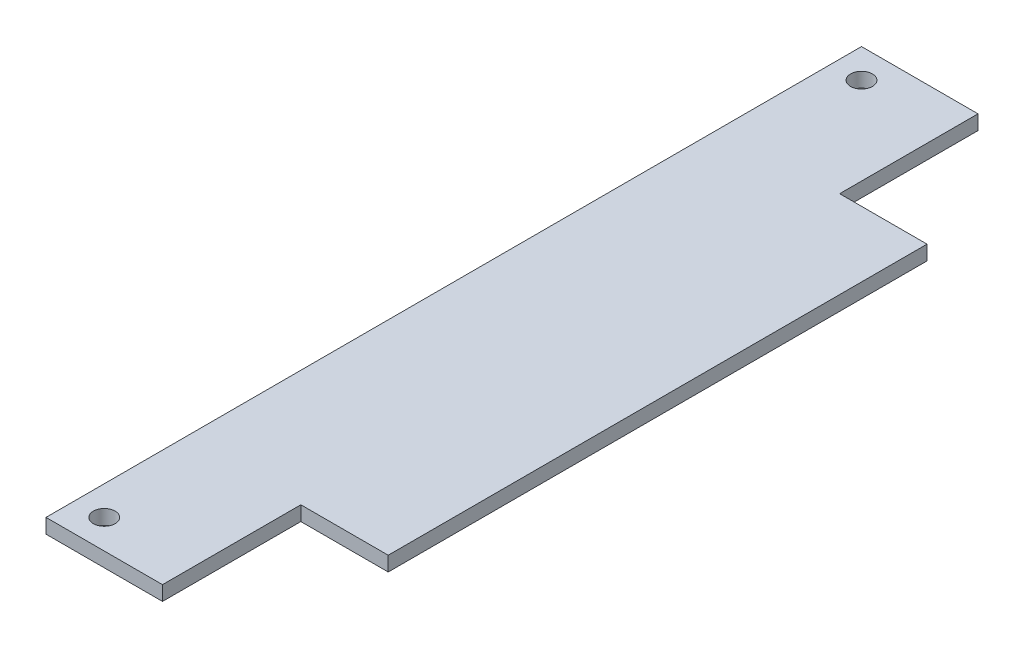
ISO-10303-21;
HEADER;
FILE_DESCRIPTION(('STEP AP214'),'2;1');
FILE_NAME('part.step','',(''),(''),'','','');
FILE_SCHEMA(('AUTOMOTIVE_DESIGN { 1 0 10303 214 1 1 1 1 }'));
ENDSEC;
DATA;
#1=APPLICATION_CONTEXT('core data for automotive mechanical design processes');
#2=APPLICATION_PROTOCOL_DEFINITION('international standard','automotive_design',2000,#1);
#3=PRODUCT_CONTEXT('',#1,'mechanical');
#4=PRODUCT('Part','Part','',(#3));
#5=PRODUCT_RELATED_PRODUCT_CATEGORY('part','',(#4));
#6=PRODUCT_DEFINITION_FORMATION('','',#4);
#7=PRODUCT_DEFINITION_CONTEXT('part definition',#1,'design');
#8=PRODUCT_DEFINITION('design','',#6,#7);
#9=PRODUCT_DEFINITION_SHAPE('','',#8);
#10=(LENGTH_UNIT() NAMED_UNIT(*) SI_UNIT(.MILLI.,.METRE.));
#11=(NAMED_UNIT(*) PLANE_ANGLE_UNIT() SI_UNIT($,.RADIAN.));
#12=(NAMED_UNIT(*) SI_UNIT($,.STERADIAN.) SOLID_ANGLE_UNIT());
#13=UNCERTAINTY_MEASURE_WITH_UNIT(LENGTH_MEASURE(1.E-05),#10,'distance_accuracy_value','');
#14=(GEOMETRIC_REPRESENTATION_CONTEXT(3) GLOBAL_UNCERTAINTY_ASSIGNED_CONTEXT((#13)) GLOBAL_UNIT_ASSIGNED_CONTEXT((#10,
#11,#12)) REPRESENTATION_CONTEXT('',''));
#15=CARTESIAN_POINT('',(0.,0.,0.));
#16=DIRECTION('',(0.,0.,1.));
#17=DIRECTION('',(1.,0.,0.));
#18=AXIS2_PLACEMENT_3D('',#15,#16,#17);
#19=CARTESIAN_POINT('',(1.29526019539602E-13,3.175,-177.8));
#20=DIRECTION('',(0.,0.,-1.));
#21=DIRECTION('',(-1.,0.,0.));
#22=AXIS2_PLACEMENT_3D('',#19,#20,#21);
#23=PLANE('',#22);
#24=DIRECTION('',(0.,-1.,0.));
#25=VECTOR('',#24,1.);
#26=CARTESIAN_POINT('',(0.,3.175,-177.8));
#27=LINE('',#26,#25);
#28=CARTESIAN_POINT('',(0.,3.175,-177.8));
#29=VERTEX_POINT('',#28);
#30=CARTESIAN_POINT('',(0.,-3.175,-177.8));
#31=VERTEX_POINT('',#30);
#32=EDGE_CURVE('E177',#29,#31,#27,.T.);
#33=ORIENTED_EDGE('',*,*,#32,.T.);
#34=DIRECTION('',(1.,0.,0.));
#35=VECTOR('',#34,1.);
#36=CARTESIAN_POINT('',(1.29526019539602E-13,-3.175,-177.8));
#37=LINE('',#36,#35);
#38=CARTESIAN_POINT('',(-50.8,-3.175,-177.8));
#39=VERTEX_POINT('',#38);
#40=EDGE_CURVE('E139',#39,#31,#37,.T.);
#41=ORIENTED_EDGE('',*,*,#40,.F.);
#42=DIRECTION('',(0.,-1.,0.));
#43=VECTOR('',#42,1.);
#44=CARTESIAN_POINT('',(-50.8,3.175,-177.8));
#45=LINE('',#44,#43);
#46=CARTESIAN_POINT('',(-50.8,3.175,-177.8));
#47=VERTEX_POINT('',#46);
#48=EDGE_CURVE('E130',#47,#39,#45,.T.);
#49=ORIENTED_EDGE('',*,*,#48,.F.);
#50=DIRECTION('',(1.,0.,0.));
#51=VECTOR('',#50,1.);
#52=CARTESIAN_POINT('',(1.29526019539602E-13,3.175,-177.8));
#53=LINE('',#52,#51);
#54=EDGE_CURVE('E43',#47,#29,#53,.T.);
#55=ORIENTED_EDGE('',*,*,#54,.T.);
#56=EDGE_LOOP('',(#33,#41,#49,#55));
#57=FACE_BOUND('',#56,.T.);
#58=ADVANCED_FACE('F35',(#57),#23,.T.);
#59=CARTESIAN_POINT('',(1.29526019539602E-13,3.175,177.8));
#60=DIRECTION('',(0.,0.,1.));
#61=DIRECTION('',(1.,0.,0.));
#62=AXIS2_PLACEMENT_3D('',#59,#60,#61);
#63=PLANE('',#62);
#64=DIRECTION('',(0.,-1.,0.));
#65=VECTOR('',#64,1.);
#66=CARTESIAN_POINT('',(0.,3.175,177.8));
#67=LINE('',#66,#65);
#68=CARTESIAN_POINT('',(0.,3.175,177.8));
#69=VERTEX_POINT('',#68);
#70=CARTESIAN_POINT('',(0.,-3.175,177.8));
#71=VERTEX_POINT('',#70);
#72=EDGE_CURVE('E51',#69,#71,#67,.T.);
#73=ORIENTED_EDGE('',*,*,#72,.F.);
#74=DIRECTION('',(-1.,0.,0.));
#75=VECTOR('',#74,1.);
#76=CARTESIAN_POINT('',(1.29526019539602E-13,3.175,177.8));
#77=LINE('',#76,#75);
#78=CARTESIAN_POINT('',(-50.8,3.175,177.8));
#79=VERTEX_POINT('',#78);
#80=EDGE_CURVE('E11',#69,#79,#77,.T.);
#81=ORIENTED_EDGE('',*,*,#80,.T.);
#82=DIRECTION('',(0.,-1.,0.));
#83=VECTOR('',#82,1.);
#84=CARTESIAN_POINT('',(-50.8,3.175,177.8));
#85=LINE('',#84,#83);
#86=CARTESIAN_POINT('',(-50.8,-3.175,177.8));
#87=VERTEX_POINT('',#86);
#88=EDGE_CURVE('E127',#79,#87,#85,.T.);
#89=ORIENTED_EDGE('',*,*,#88,.T.);
#90=DIRECTION('',(-1.,0.,0.));
#91=VECTOR('',#90,1.);
#92=CARTESIAN_POINT('',(1.29526019539602E-13,-3.175,177.8));
#93=LINE('',#92,#91);
#94=EDGE_CURVE('E115',#71,#87,#93,.T.);
#95=ORIENTED_EDGE('',*,*,#94,.F.);
#96=EDGE_LOOP('',(#73,#81,#89,#95));
#97=FACE_BOUND('',#96,.T.);
#98=ADVANCED_FACE('F112',(#97),#63,.T.);
#99=CARTESIAN_POINT('',(38.1,3.175,0.));
#100=DIRECTION('',(1.,0.,0.));
#101=DIRECTION('',(0.,0.,-1.));
#102=AXIS2_PLACEMENT_3D('',#99,#100,#101);
#103=PLANE('',#102);
#104=DIRECTION('',(0.,-1.,0.));
#105=VECTOR('',#104,1.);
#106=CARTESIAN_POINT('',(38.1,3.175,117.475));
#107=LINE('',#106,#105);
#108=CARTESIAN_POINT('',(38.1,3.175,117.475));
#109=VERTEX_POINT('',#108);
#110=CARTESIAN_POINT('',(38.1,-3.175,117.475));
#111=VERTEX_POINT('',#110);
#112=EDGE_CURVE('E158',#109,#111,#107,.T.);
#113=ORIENTED_EDGE('',*,*,#112,.T.);
#114=DIRECTION('',(0.,0.,1.));
#115=VECTOR('',#114,1.);
#116=CARTESIAN_POINT('',(38.1,-3.175,0.));
#117=LINE('',#116,#115);
#118=CARTESIAN_POINT('',(38.1,-3.175,-117.475));
#119=VERTEX_POINT('',#118);
#120=EDGE_CURVE('E38',#119,#111,#117,.T.);
#121=ORIENTED_EDGE('',*,*,#120,.F.);
#122=DIRECTION('',(0.,-1.,0.));
#123=VECTOR('',#122,1.);
#124=CARTESIAN_POINT('',(38.1000000000001,3.175,-117.475));
#125=LINE('',#124,#123);
#126=CARTESIAN_POINT('',(38.1000000000001,3.175,-117.475));
#127=VERTEX_POINT('',#126);
#128=EDGE_CURVE('E59',#127,#119,#125,.T.);
#129=ORIENTED_EDGE('',*,*,#128,.F.);
#130=DIRECTION('',(0.,0.,1.));
#131=VECTOR('',#130,1.);
#132=CARTESIAN_POINT('',(38.1,3.175,0.));
#133=LINE('',#132,#131);
#134=EDGE_CURVE('E141',#127,#109,#133,.T.);
#135=ORIENTED_EDGE('',*,*,#134,.T.);
#136=EDGE_LOOP('',(#113,#121,#129,#135));
#137=FACE_BOUND('',#136,.T.);
#138=ADVANCED_FACE('F156',(#137),#103,.T.);
#139=CARTESIAN_POINT('',(0.,3.175,0.));
#140=DIRECTION('',(0.,1.,0.));
#141=DIRECTION('',(0.,0.,1.));
#142=AXIS2_PLACEMENT_3D('',#139,#140,#141);
#143=PLANE('',#142);
#144=DIRECTION('',(1.,0.,0.));
#145=VECTOR('',#144,1.);
#146=CARTESIAN_POINT('',(38.1,3.175,117.475));
#147=LINE('',#146,#145);
#148=CARTESIAN_POINT('',(0.,3.175,117.475));
#149=VERTEX_POINT('',#148);
#150=EDGE_CURVE('E107',#149,#109,#147,.T.);
#151=ORIENTED_EDGE('',*,*,#150,.T.);
#152=ORIENTED_EDGE('',*,*,#134,.F.);
#153=DIRECTION('',(-1.,0.,0.));
#154=VECTOR('',#153,1.);
#155=CARTESIAN_POINT('',(38.1000000000001,3.175,-117.475));
#156=LINE('',#155,#154);
#157=CARTESIAN_POINT('',(0.,3.175,-117.475));
#158=VERTEX_POINT('',#157);
#159=EDGE_CURVE('E169',#127,#158,#156,.T.);
#160=ORIENTED_EDGE('',*,*,#159,.T.);
#161=DIRECTION('',(0.,0.,-1.));
#162=VECTOR('',#161,1.);
#163=CARTESIAN_POINT('',(0.,3.175,-177.8));
#164=LINE('',#163,#162);
#165=EDGE_CURVE('E172',#158,#29,#164,.T.);
#166=ORIENTED_EDGE('',*,*,#165,.T.);
#167=ORIENTED_EDGE('',*,*,#54,.F.);
#168=DIRECTION('',(0.,0.,-1.));
#169=VECTOR('',#168,1.);
#170=CARTESIAN_POINT('',(-50.8,3.175,177.8));
#171=LINE('',#170,#169);
#172=EDGE_CURVE('E121',#79,#47,#171,.T.);
#173=ORIENTED_EDGE('',*,*,#172,.F.);
#174=ORIENTED_EDGE('',*,*,#80,.F.);
#175=DIRECTION('',(0.,0.,-1.));
#176=VECTOR('',#175,1.);
#177=CARTESIAN_POINT('',(0.,3.175,177.8));
#178=LINE('',#177,#176);
#179=EDGE_CURVE('E100',#69,#149,#178,.T.);
#180=ORIENTED_EDGE('',*,*,#179,.T.);
#181=EDGE_LOOP('',(#151,#152,#160,#166,#167,#173,#174,#180));
#182=FACE_BOUND('',#181,.T.);
#183=CARTESIAN_POINT('',(-38.1,3.175,165.1));
#184=DIRECTION('',(0.,-1.,0.));
#185=DIRECTION('',(0.,0.,-1.));
#186=AXIS2_PLACEMENT_3D('',#183,#184,#185);
#187=CIRCLE('',#186,4.7625);
#188=CARTESIAN_POINT('',(-38.1,3.175,160.3375));
#189=VERTEX_POINT('',#188);
#190=EDGE_CURVE('E163',#189,#189,#187,.T.);
#191=ORIENTED_EDGE('',*,*,#190,.T.);
#192=EDGE_LOOP('',(#191));
#193=FACE_BOUND('',#192,.T.);
#194=CARTESIAN_POINT('',(-38.1,3.175,-165.1));
#195=DIRECTION('',(0.,-1.,0.));
#196=DIRECTION('',(0.,0.,-1.));
#197=AXIS2_PLACEMENT_3D('',#194,#195,#196);
#198=CIRCLE('',#197,4.7625);
#199=CARTESIAN_POINT('',(-38.1,3.175,-169.8625));
#200=VERTEX_POINT('',#199);
#201=EDGE_CURVE('E133',#200,#200,#198,.T.);
#202=ORIENTED_EDGE('',*,*,#201,.T.);
#203=EDGE_LOOP('',(#202));
#204=FACE_BOUND('',#203,.T.);
#205=ADVANCED_FACE('F118',(#182,#193,#204),#143,.T.);
#206=CARTESIAN_POINT('',(0.,-3.175,0.));
#207=DIRECTION('',(0.,1.,0.));
#208=DIRECTION('',(0.,0.,1.));
#209=AXIS2_PLACEMENT_3D('',#206,#207,#208);
#210=PLANE('',#209);
#211=ORIENTED_EDGE('',*,*,#120,.T.);
#212=DIRECTION('',(1.,0.,0.));
#213=VECTOR('',#212,1.);
#214=CARTESIAN_POINT('',(38.1,-3.175,117.475));
#215=LINE('',#214,#213);
#216=CARTESIAN_POINT('',(0.,-3.175,117.475));
#217=VERTEX_POINT('',#216);
#218=EDGE_CURVE('E108',#217,#111,#215,.T.);
#219=ORIENTED_EDGE('',*,*,#218,.F.);
#220=DIRECTION('',(0.,0.,-1.));
#221=VECTOR('',#220,1.);
#222=CARTESIAN_POINT('',(0.,-3.175,177.8));
#223=LINE('',#222,#221);
#224=EDGE_CURVE('E180',#71,#217,#223,.T.);
#225=ORIENTED_EDGE('',*,*,#224,.F.);
#226=ORIENTED_EDGE('',*,*,#94,.T.);
#227=DIRECTION('',(0.,0.,-1.));
#228=VECTOR('',#227,1.);
#229=CARTESIAN_POINT('',(-50.8,-3.175,177.8));
#230=LINE('',#229,#228);
#231=EDGE_CURVE('E128',#87,#39,#230,.T.);
#232=ORIENTED_EDGE('',*,*,#231,.T.);
#233=ORIENTED_EDGE('',*,*,#40,.T.);
#234=DIRECTION('',(0.,0.,-1.));
#235=VECTOR('',#234,1.);
#236=CARTESIAN_POINT('',(0.,-3.175,-177.8));
#237=LINE('',#236,#235);
#238=CARTESIAN_POINT('',(0.,-3.175,-117.475));
#239=VERTEX_POINT('',#238);
#240=EDGE_CURVE('E173',#239,#31,#237,.T.);
#241=ORIENTED_EDGE('',*,*,#240,.F.);
#242=DIRECTION('',(-1.,0.,0.));
#243=VECTOR('',#242,1.);
#244=CARTESIAN_POINT('',(38.1000000000001,-3.175,-117.475));
#245=LINE('',#244,#243);
#246=EDGE_CURVE('E153',#119,#239,#245,.T.);
#247=ORIENTED_EDGE('',*,*,#246,.F.);
#248=EDGE_LOOP('',(#211,#219,#225,#226,#232,#233,#241,#247));
#249=FACE_BOUND('',#248,.T.);
#250=CARTESIAN_POINT('',(-38.1,-3.175,165.1));
#251=DIRECTION('',(0.,-1.,0.));
#252=DIRECTION('',(0.,0.,-1.));
#253=AXIS2_PLACEMENT_3D('',#250,#251,#252);
#254=CIRCLE('',#253,4.7625);
#255=CARTESIAN_POINT('',(-38.1,-3.175,160.3375));
#256=VERTEX_POINT('',#255);
#257=EDGE_CURVE('E160',#256,#256,#254,.T.);
#258=ORIENTED_EDGE('',*,*,#257,.F.);
#259=EDGE_LOOP('',(#258));
#260=FACE_BOUND('',#259,.T.);
#261=CARTESIAN_POINT('',(-38.1,-3.175,-165.1));
#262=DIRECTION('',(0.,-1.,0.));
#263=DIRECTION('',(0.,0.,-1.));
#264=AXIS2_PLACEMENT_3D('',#261,#262,#263);
#265=CIRCLE('',#264,4.7625);
#266=CARTESIAN_POINT('',(-38.1,-3.175,-169.8625));
#267=VERTEX_POINT('',#266);
#268=EDGE_CURVE('E136',#267,#267,#265,.T.);
#269=ORIENTED_EDGE('',*,*,#268,.F.);
#270=EDGE_LOOP('',(#269));
#271=FACE_BOUND('',#270,.T.);
#272=ADVANCED_FACE('F150',(#249,#260,#271),#210,.F.);
#273=CARTESIAN_POINT('',(-50.8,3.175,177.8));
#274=DIRECTION('',(-1.,0.,0.));
#275=DIRECTION('',(0.,0.,1.));
#276=AXIS2_PLACEMENT_3D('',#273,#274,#275);
#277=PLANE('',#276);
#278=ORIENTED_EDGE('',*,*,#231,.F.);
#279=ORIENTED_EDGE('',*,*,#88,.F.);
#280=ORIENTED_EDGE('',*,*,#172,.T.);
#281=ORIENTED_EDGE('',*,*,#48,.T.);
#282=EDGE_LOOP('',(#278,#279,#280,#281));
#283=FACE_BOUND('',#282,.T.);
#284=ADVANCED_FACE('F194',(#283),#277,.T.);
#285=CARTESIAN_POINT('',(-38.1,3.175,-165.1));
#286=DIRECTION('',(0.,-1.,0.));
#287=DIRECTION('',(0.,0.,-1.));
#288=AXIS2_PLACEMENT_3D('',#285,#286,#287);
#289=CYLINDRICAL_SURFACE('',#288,4.7625);
#290=ORIENTED_EDGE('',*,*,#201,.F.);
#291=EDGE_LOOP('',(#290));
#292=FACE_BOUND('',#291,.T.);
#293=ORIENTED_EDGE('',*,*,#268,.T.);
#294=EDGE_LOOP('',(#293));
#295=FACE_BOUND('',#294,.T.);
#296=ADVANCED_FACE('F191',(#292,#295),#289,.F.);
#297=CARTESIAN_POINT('',(-38.1,3.175,165.1));
#298=DIRECTION('',(0.,-1.,0.));
#299=DIRECTION('',(0.,0.,-1.));
#300=AXIS2_PLACEMENT_3D('',#297,#298,#299);
#301=CYLINDRICAL_SURFACE('',#300,4.7625);
#302=ORIENTED_EDGE('',*,*,#190,.F.);
#303=EDGE_LOOP('',(#302));
#304=FACE_BOUND('',#303,.T.);
#305=ORIENTED_EDGE('',*,*,#257,.T.);
#306=EDGE_LOOP('',(#305));
#307=FACE_BOUND('',#306,.T.);
#308=ADVANCED_FACE('F221',(#304,#307),#301,.F.);
#309=CARTESIAN_POINT('',(0.,3.175,-177.8));
#310=DIRECTION('',(-1.,0.,0.));
#311=DIRECTION('',(0.,0.,1.));
#312=AXIS2_PLACEMENT_3D('',#309,#310,#311);
#313=PLANE('',#312);
#314=ORIENTED_EDGE('',*,*,#240,.T.);
#315=ORIENTED_EDGE('',*,*,#32,.F.);
#316=ORIENTED_EDGE('',*,*,#165,.F.);
#317=DIRECTION('',(0.,-1.,0.));
#318=VECTOR('',#317,1.);
#319=CARTESIAN_POINT('',(0.,3.175,-117.475));
#320=LINE('',#319,#318);
#321=EDGE_CURVE('E181',#158,#239,#320,.T.);
#322=ORIENTED_EDGE('',*,*,#321,.T.);
#323=EDGE_LOOP('',(#314,#315,#316,#322));
#324=FACE_BOUND('',#323,.T.);
#325=ADVANCED_FACE('F211',(#324),#313,.F.);
#326=CARTESIAN_POINT('',(38.1000000000001,3.175,-117.475));
#327=DIRECTION('',(0.,0.,1.));
#328=DIRECTION('',(1.,0.,0.));
#329=AXIS2_PLACEMENT_3D('',#326,#327,#328);
#330=PLANE('',#329);
#331=ORIENTED_EDGE('',*,*,#246,.T.);
#332=ORIENTED_EDGE('',*,*,#321,.F.);
#333=ORIENTED_EDGE('',*,*,#159,.F.);
#334=ORIENTED_EDGE('',*,*,#128,.T.);
#335=EDGE_LOOP('',(#331,#332,#333,#334));
#336=FACE_BOUND('',#335,.T.);
#337=ADVANCED_FACE('F212',(#336),#330,.F.);
#338=CARTESIAN_POINT('',(38.1,3.175,117.475));
#339=DIRECTION('',(0.,0.,-1.));
#340=DIRECTION('',(-1.,0.,0.));
#341=AXIS2_PLACEMENT_3D('',#338,#339,#340);
#342=PLANE('',#341);
#343=ORIENTED_EDGE('',*,*,#218,.T.);
#344=ORIENTED_EDGE('',*,*,#112,.F.);
#345=ORIENTED_EDGE('',*,*,#150,.F.);
#346=DIRECTION('',(0.,-1.,0.));
#347=VECTOR('',#346,1.);
#348=CARTESIAN_POINT('',(0.,3.175,117.475));
#349=LINE('',#348,#347);
#350=EDGE_CURVE('E102',#149,#217,#349,.T.);
#351=ORIENTED_EDGE('',*,*,#350,.T.);
#352=EDGE_LOOP('',(#343,#344,#345,#351));
#353=FACE_BOUND('',#352,.T.);
#354=ADVANCED_FACE('F214',(#353),#342,.F.);
#355=CARTESIAN_POINT('',(0.,3.175,177.8));
#356=DIRECTION('',(-1.,0.,0.));
#357=DIRECTION('',(0.,0.,1.));
#358=AXIS2_PLACEMENT_3D('',#355,#356,#357);
#359=PLANE('',#358);
#360=ORIENTED_EDGE('',*,*,#224,.T.);
#361=ORIENTED_EDGE('',*,*,#350,.F.);
#362=ORIENTED_EDGE('',*,*,#179,.F.);
#363=ORIENTED_EDGE('',*,*,#72,.T.);
#364=EDGE_LOOP('',(#360,#361,#362,#363));
#365=FACE_BOUND('',#364,.T.);
#366=ADVANCED_FACE('F101',(#365),#359,.F.);
#367=CLOSED_SHELL('',(#58,#98,#138,#205,#272,#284,#296,#308,#325,#337,#354,#366));
#368=MANIFOLD_SOLID_BREP('B2',#367);
#369=ADVANCED_BREP_SHAPE_REPRESENTATION('',(#18,#368),#14);
#370=SHAPE_DEFINITION_REPRESENTATION(#9,#369);
ENDSEC;
END-ISO-10303-21;
